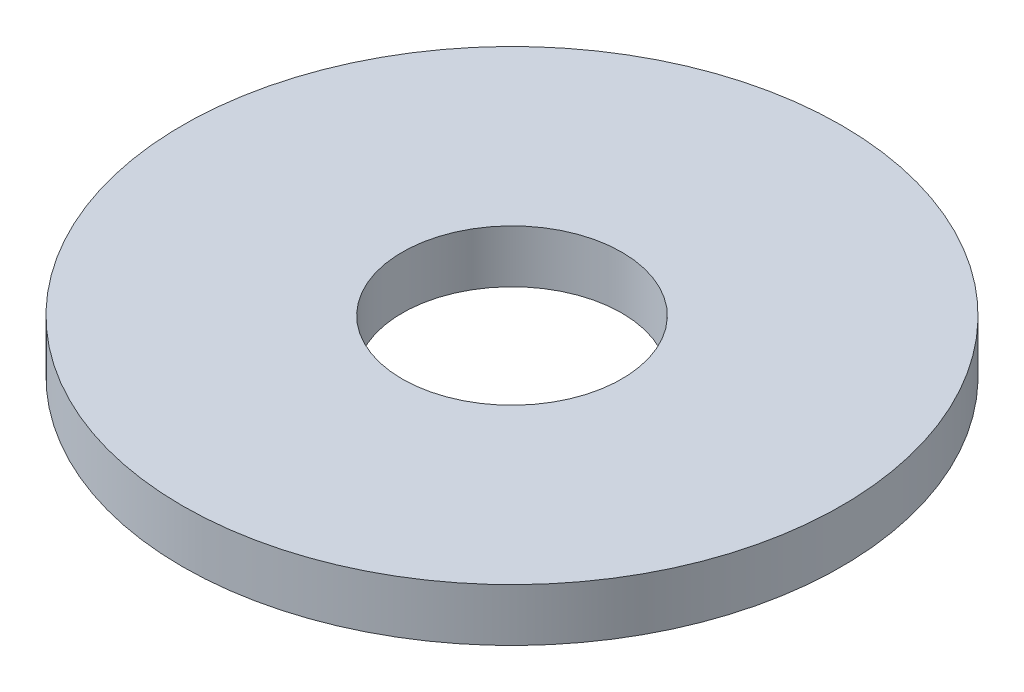
ISO-10303-21;
HEADER;
FILE_DESCRIPTION(('STEP AP214'),'2;1');
FILE_NAME('part.step','',(''),(''),'','','');
FILE_SCHEMA(('AUTOMOTIVE_DESIGN { 1 0 10303 214 1 1 1 1 }'));
ENDSEC;
DATA;
#1=APPLICATION_CONTEXT('core data for automotive mechanical design processes');
#2=APPLICATION_PROTOCOL_DEFINITION('international standard','automotive_design',2000,#1);
#3=PRODUCT_CONTEXT('',#1,'mechanical');
#4=PRODUCT('Part','Part','',(#3));
#5=PRODUCT_RELATED_PRODUCT_CATEGORY('part','',(#4));
#6=PRODUCT_DEFINITION_FORMATION('','',#4);
#7=PRODUCT_DEFINITION_CONTEXT('part definition',#1,'design');
#8=PRODUCT_DEFINITION('design','',#6,#7);
#9=PRODUCT_DEFINITION_SHAPE('','',#8);
#10=(LENGTH_UNIT() NAMED_UNIT(*) SI_UNIT(.MILLI.,.METRE.));
#11=(NAMED_UNIT(*) PLANE_ANGLE_UNIT() SI_UNIT($,.RADIAN.));
#12=(NAMED_UNIT(*) SI_UNIT($,.STERADIAN.) SOLID_ANGLE_UNIT());
#13=UNCERTAINTY_MEASURE_WITH_UNIT(LENGTH_MEASURE(1.E-05),#10,'distance_accuracy_value','');
#14=(GEOMETRIC_REPRESENTATION_CONTEXT(3) GLOBAL_UNCERTAINTY_ASSIGNED_CONTEXT((#13)) GLOBAL_UNIT_ASSIGNED_CONTEXT((#10,
#11,#12)) REPRESENTATION_CONTEXT('',''));
#15=CARTESIAN_POINT('',(0.,0.,0.));
#16=DIRECTION('',(0.,0.,1.));
#17=DIRECTION('',(1.,0.,0.));
#18=AXIS2_PLACEMENT_3D('',#15,#16,#17);
#19=CARTESIAN_POINT('',(0.,1.2,0.));
#20=DIRECTION('',(0.,1.,0.));
#21=DIRECTION('',(0.,0.,1.));
#22=AXIS2_PLACEMENT_3D('',#19,#20,#21);
#23=PLANE('',#22);
#24=CARTESIAN_POINT('',(0.,1.2,0.));
#25=DIRECTION('',(0.,1.,0.));
#26=DIRECTION('',(0.,0.,1.));
#27=AXIS2_PLACEMENT_3D('',#24,#25,#26);
#28=CIRCLE('',#27,7.5);
#29=CARTESIAN_POINT('',(0.,1.2,7.5));
#30=VERTEX_POINT('',#29);
#31=EDGE_CURVE('E10',#30,#30,#28,.T.);
#32=ORIENTED_EDGE('',*,*,#31,.T.);
#33=EDGE_LOOP('',(#32));
#34=FACE_BOUND('',#33,.T.);
#35=CARTESIAN_POINT('',(0.,1.2,0.));
#36=DIRECTION('',(0.,1.,0.));
#37=DIRECTION('',(0.,0.,1.));
#38=AXIS2_PLACEMENT_3D('',#35,#36,#37);
#39=CIRCLE('',#38,2.5);
#40=CARTESIAN_POINT('',(0.,1.2,2.5));
#41=VERTEX_POINT('',#40);
#42=EDGE_CURVE('E42',#41,#41,#39,.T.);
#43=ORIENTED_EDGE('',*,*,#42,.F.);
#44=EDGE_LOOP('',(#43));
#45=FACE_BOUND('',#44,.T.);
#46=ADVANCED_FACE('F31',(#34,#45),#23,.T.);
#47=CARTESIAN_POINT('',(0.,0.,0.));
#48=DIRECTION('',(0.,1.,0.));
#49=DIRECTION('',(0.,0.,1.));
#50=AXIS2_PLACEMENT_3D('',#47,#48,#49);
#51=PLANE('',#50);
#52=CARTESIAN_POINT('',(0.,0.,0.));
#53=DIRECTION('',(0.,1.,0.));
#54=DIRECTION('',(0.,0.,1.));
#55=AXIS2_PLACEMENT_3D('',#52,#53,#54);
#56=CIRCLE('',#55,7.5);
#57=CARTESIAN_POINT('',(0.,0.,7.5));
#58=VERTEX_POINT('',#57);
#59=EDGE_CURVE('E35',#58,#58,#56,.T.);
#60=ORIENTED_EDGE('',*,*,#59,.F.);
#61=EDGE_LOOP('',(#60));
#62=FACE_BOUND('',#61,.T.);
#63=CARTESIAN_POINT('',(0.,0.,0.));
#64=DIRECTION('',(0.,1.,0.));
#65=DIRECTION('',(0.,0.,1.));
#66=AXIS2_PLACEMENT_3D('',#63,#64,#65);
#67=CIRCLE('',#66,2.5);
#68=CARTESIAN_POINT('',(0.,0.,2.5));
#69=VERTEX_POINT('',#68);
#70=EDGE_CURVE('E44',#69,#69,#67,.T.);
#71=ORIENTED_EDGE('',*,*,#70,.T.);
#72=EDGE_LOOP('',(#71));
#73=FACE_BOUND('',#72,.T.);
#74=ADVANCED_FACE('F54',(#62,#73),#51,.F.);
#75=CARTESIAN_POINT('',(0.,1.2,0.));
#76=DIRECTION('',(0.,-1.,0.));
#77=DIRECTION('',(0.,0.,-1.));
#78=AXIS2_PLACEMENT_3D('',#75,#76,#77);
#79=CYLINDRICAL_SURFACE('',#78,7.5);
#80=ORIENTED_EDGE('',*,*,#31,.F.);
#81=EDGE_LOOP('',(#80));
#82=FACE_BOUND('',#81,.T.);
#83=ORIENTED_EDGE('',*,*,#59,.T.);
#84=EDGE_LOOP('',(#83));
#85=FACE_BOUND('',#84,.T.);
#86=ADVANCED_FACE('F33',(#82,#85),#79,.T.);
#87=CARTESIAN_POINT('',(0.,1.2,0.));
#88=DIRECTION('',(0.,-1.,0.));
#89=DIRECTION('',(0.,0.,-1.));
#90=AXIS2_PLACEMENT_3D('',#87,#88,#89);
#91=CYLINDRICAL_SURFACE('',#90,2.5);
#92=ORIENTED_EDGE('',*,*,#42,.T.);
#93=EDGE_LOOP('',(#92));
#94=FACE_BOUND('',#93,.T.);
#95=ORIENTED_EDGE('',*,*,#70,.F.);
#96=EDGE_LOOP('',(#95));
#97=FACE_BOUND('',#96,.T.);
#98=ADVANCED_FACE('F50',(#94,#97),#91,.F.);
#99=CLOSED_SHELL('',(#46,#74,#86,#98));
#100=MANIFOLD_SOLID_BREP('B2',#99);
#101=ADVANCED_BREP_SHAPE_REPRESENTATION('',(#18,#100),#14);
#102=SHAPE_DEFINITION_REPRESENTATION(#9,#101);
ENDSEC;
END-ISO-10303-21;
